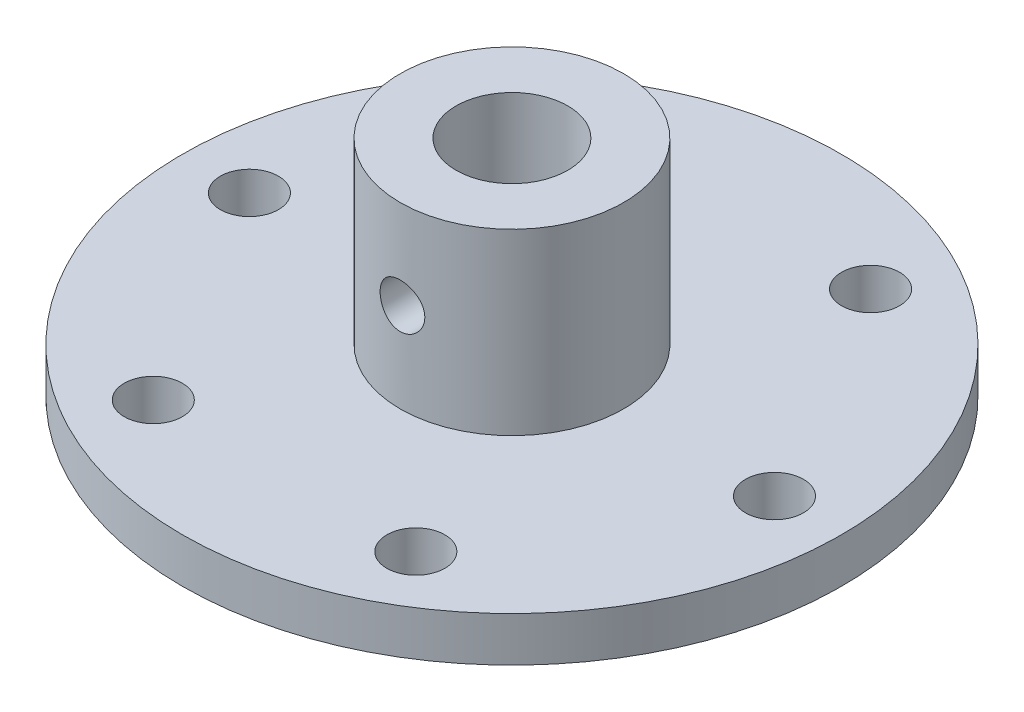
ISO-10303-21;
HEADER;
FILE_DESCRIPTION(('STEP AP214'),'2;1');
FILE_NAME('part.step','',(''),(''),'','','');
FILE_SCHEMA(('AUTOMOTIVE_DESIGN { 1 0 10303 214 1 1 1 1 }'));
ENDSEC;
DATA;
#1=APPLICATION_CONTEXT('core data for automotive mechanical design processes');
#2=APPLICATION_PROTOCOL_DEFINITION('international standard','automotive_design',2000,#1);
#3=PRODUCT_CONTEXT('',#1,'mechanical');
#4=PRODUCT('Part','Part','',(#3));
#5=PRODUCT_RELATED_PRODUCT_CATEGORY('part','',(#4));
#6=PRODUCT_DEFINITION_FORMATION('','',#4);
#7=PRODUCT_DEFINITION_CONTEXT('part definition',#1,'design');
#8=PRODUCT_DEFINITION('design','',#6,#7);
#9=PRODUCT_DEFINITION_SHAPE('','',#8);
#10=(LENGTH_UNIT() NAMED_UNIT(*) SI_UNIT(.MILLI.,.METRE.));
#11=(NAMED_UNIT(*) PLANE_ANGLE_UNIT() SI_UNIT($,.RADIAN.));
#12=(NAMED_UNIT(*) SI_UNIT($,.STERADIAN.) SOLID_ANGLE_UNIT());
#13=UNCERTAINTY_MEASURE_WITH_UNIT(LENGTH_MEASURE(1.E-05),#10,'distance_accuracy_value','');
#14=(GEOMETRIC_REPRESENTATION_CONTEXT(3) GLOBAL_UNCERTAINTY_ASSIGNED_CONTEXT((#13)) GLOBAL_UNIT_ASSIGNED_CONTEXT((#10,
#11,#12)) REPRESENTATION_CONTEXT('',''));
#15=CARTESIAN_POINT('',(0.,0.,0.));
#16=DIRECTION('',(0.,0.,1.));
#17=DIRECTION('',(1.,0.,0.));
#18=AXIS2_PLACEMENT_3D('',#15,#16,#17);
#19=CARTESIAN_POINT('',(0.,4.,0.));
#20=DIRECTION('',(0.,-1.,0.));
#21=DIRECTION('',(0.,0.,-1.));
#22=AXIS2_PLACEMENT_3D('',#19,#20,#21);
#23=CYLINDRICAL_SURFACE('',#22,29.5);
#24=CARTESIAN_POINT('',(0.,4.,0.));
#25=DIRECTION('',(0.,1.,0.));
#26=DIRECTION('',(0.,0.,1.));
#27=AXIS2_PLACEMENT_3D('',#24,#25,#26);
#28=CIRCLE('',#27,29.5);
#29=CARTESIAN_POINT('',(0.,4.,29.5));
#30=VERTEX_POINT('',#29);
#31=EDGE_CURVE('E10',#30,#30,#28,.T.);
#32=ORIENTED_EDGE('',*,*,#31,.F.);
#33=EDGE_LOOP('',(#32));
#34=FACE_BOUND('',#33,.T.);
#35=CARTESIAN_POINT('',(0.,0.,0.));
#36=DIRECTION('',(0.,1.,0.));
#37=DIRECTION('',(0.,0.,1.));
#38=AXIS2_PLACEMENT_3D('',#35,#36,#37);
#39=CIRCLE('',#38,29.5);
#40=CARTESIAN_POINT('',(0.,0.,29.5));
#41=VERTEX_POINT('',#40);
#42=EDGE_CURVE('E75',#41,#41,#39,.T.);
#43=ORIENTED_EDGE('',*,*,#42,.T.);
#44=EDGE_LOOP('',(#43));
#45=FACE_BOUND('',#44,.T.);
#46=ADVANCED_FACE('F34',(#34,#45),#23,.T.);
#47=CARTESIAN_POINT('',(23.5,4.,0.));
#48=DIRECTION('',(0.,-1.,0.));
#49=DIRECTION('',(0.,0.,-1.));
#50=AXIS2_PLACEMENT_3D('',#47,#48,#49);
#51=CYLINDRICAL_SURFACE('',#50,2.6);
#52=CARTESIAN_POINT('',(23.5,4.,0.));
#53=DIRECTION('',(0.,1.,0.));
#54=DIRECTION('',(0.,0.,1.));
#55=AXIS2_PLACEMENT_3D('',#52,#53,#54);
#56=CIRCLE('',#55,2.6);
#57=CARTESIAN_POINT('',(23.5,4.,2.6));
#58=VERTEX_POINT('',#57);
#59=EDGE_CURVE('E47',#58,#58,#56,.T.);
#60=ORIENTED_EDGE('',*,*,#59,.T.);
#61=EDGE_LOOP('',(#60));
#62=FACE_BOUND('',#61,.T.);
#63=CARTESIAN_POINT('',(23.5,0.,0.));
#64=DIRECTION('',(0.,1.,0.));
#65=DIRECTION('',(0.,0.,1.));
#66=AXIS2_PLACEMENT_3D('',#63,#64,#65);
#67=CIRCLE('',#66,2.6);
#68=CARTESIAN_POINT('',(23.5,0.,2.6));
#69=VERTEX_POINT('',#68);
#70=EDGE_CURVE('E72',#69,#69,#67,.T.);
#71=ORIENTED_EDGE('',*,*,#70,.F.);
#72=EDGE_LOOP('',(#71));
#73=FACE_BOUND('',#72,.T.);
#74=ADVANCED_FACE('F123',(#62,#73),#51,.F.);
#75=CARTESIAN_POINT('',(11.75,4.,20.3515969889343));
#76=DIRECTION('',(0.,-1.,0.));
#77=DIRECTION('',(0.,0.,-1.));
#78=AXIS2_PLACEMENT_3D('',#75,#76,#77);
#79=CYLINDRICAL_SURFACE('',#78,2.6);
#80=CARTESIAN_POINT('',(11.75,4.,20.3515969889343));
#81=DIRECTION('',(0.,1.,0.));
#82=DIRECTION('',(0.,0.,1.));
#83=AXIS2_PLACEMENT_3D('',#80,#81,#82);
#84=CIRCLE('',#83,2.6);
#85=CARTESIAN_POINT('',(11.75,4.,22.9515969889343));
#86=VERTEX_POINT('',#85);
#87=EDGE_CURVE('E52',#86,#86,#84,.T.);
#88=ORIENTED_EDGE('',*,*,#87,.T.);
#89=EDGE_LOOP('',(#88));
#90=FACE_BOUND('',#89,.T.);
#91=CARTESIAN_POINT('',(11.75,0.,20.3515969889343));
#92=DIRECTION('',(0.,1.,0.));
#93=DIRECTION('',(0.,0.,1.));
#94=AXIS2_PLACEMENT_3D('',#91,#92,#93);
#95=CIRCLE('',#94,2.6);
#96=CARTESIAN_POINT('',(11.75,0.,22.9515969889343));
#97=VERTEX_POINT('',#96);
#98=EDGE_CURVE('E69',#97,#97,#95,.T.);
#99=ORIENTED_EDGE('',*,*,#98,.F.);
#100=EDGE_LOOP('',(#99));
#101=FACE_BOUND('',#100,.T.);
#102=ADVANCED_FACE('F127',(#90,#101),#79,.F.);
#103=CARTESIAN_POINT('',(-11.7500000000001,4.,20.3515969889343));
#104=DIRECTION('',(0.,-1.,0.));
#105=DIRECTION('',(0.,0.,-1.));
#106=AXIS2_PLACEMENT_3D('',#103,#104,#105);
#107=CYLINDRICAL_SURFACE('',#106,2.6);
#108=CARTESIAN_POINT('',(-11.7500000000001,4.,20.3515969889343));
#109=DIRECTION('',(0.,1.,0.));
#110=DIRECTION('',(0.,0.,1.));
#111=AXIS2_PLACEMENT_3D('',#108,#109,#110);
#112=CIRCLE('',#111,2.6);
#113=CARTESIAN_POINT('',(-11.7500000000001,4.,22.9515969889343));
#114=VERTEX_POINT('',#113);
#115=EDGE_CURVE('E185',#114,#114,#112,.T.);
#116=ORIENTED_EDGE('',*,*,#115,.T.);
#117=EDGE_LOOP('',(#116));
#118=FACE_BOUND('',#117,.T.);
#119=CARTESIAN_POINT('',(-11.7500000000001,0.,20.3515969889343));
#120=DIRECTION('',(0.,1.,0.));
#121=DIRECTION('',(0.,0.,1.));
#122=AXIS2_PLACEMENT_3D('',#119,#120,#121);
#123=CIRCLE('',#122,2.6);
#124=CARTESIAN_POINT('',(-11.7500000000001,0.,22.9515969889343));
#125=VERTEX_POINT('',#124);
#126=EDGE_CURVE('E66',#125,#125,#123,.T.);
#127=ORIENTED_EDGE('',*,*,#126,.F.);
#128=EDGE_LOOP('',(#127));
#129=FACE_BOUND('',#128,.T.);
#130=ADVANCED_FACE('F131',(#118,#129),#107,.F.);
#131=CARTESIAN_POINT('',(-23.5,4.,-1.64099622925627E-13));
#132=DIRECTION('',(0.,-1.,0.));
#133=DIRECTION('',(0.,0.,-1.));
#134=AXIS2_PLACEMENT_3D('',#131,#132,#133);
#135=CYLINDRICAL_SURFACE('',#134,2.6);
#136=CARTESIAN_POINT('',(-23.5,4.,-1.64099622925627E-13));
#137=DIRECTION('',(0.,1.,0.));
#138=DIRECTION('',(0.,0.,1.));
#139=AXIS2_PLACEMENT_3D('',#136,#137,#138);
#140=CIRCLE('',#139,2.6);
#141=CARTESIAN_POINT('',(-23.5,4.,2.59999999999984));
#142=VERTEX_POINT('',#141);
#143=EDGE_CURVE('E182',#142,#142,#140,.T.);
#144=ORIENTED_EDGE('',*,*,#143,.T.);
#145=EDGE_LOOP('',(#144));
#146=FACE_BOUND('',#145,.T.);
#147=CARTESIAN_POINT('',(-23.5,0.,-1.64099622925627E-13));
#148=DIRECTION('',(0.,1.,0.));
#149=DIRECTION('',(0.,0.,1.));
#150=AXIS2_PLACEMENT_3D('',#147,#148,#149);
#151=CIRCLE('',#150,2.6);
#152=CARTESIAN_POINT('',(-23.5,0.,2.59999999999984));
#153=VERTEX_POINT('',#152);
#154=EDGE_CURVE('E63',#153,#153,#151,.T.);
#155=ORIENTED_EDGE('',*,*,#154,.F.);
#156=EDGE_LOOP('',(#155));
#157=FACE_BOUND('',#156,.T.);
#158=ADVANCED_FACE('F135',(#146,#157),#135,.F.);
#159=CARTESIAN_POINT('',(-11.7499999999998,4.,-20.3515969889344));
#160=DIRECTION('',(0.,-1.,0.));
#161=DIRECTION('',(0.,0.,-1.));
#162=AXIS2_PLACEMENT_3D('',#159,#160,#161);
#163=CYLINDRICAL_SURFACE('',#162,2.6);
#164=CARTESIAN_POINT('',(-11.7499999999998,4.,-20.3515969889344));
#165=DIRECTION('',(0.,1.,0.));
#166=DIRECTION('',(0.,0.,1.));
#167=AXIS2_PLACEMENT_3D('',#164,#165,#166);
#168=CIRCLE('',#167,2.6);
#169=CARTESIAN_POINT('',(-11.7499999999998,4.,-17.7515969889344));
#170=VERTEX_POINT('',#169);
#171=EDGE_CURVE('E149',#170,#170,#168,.T.);
#172=ORIENTED_EDGE('',*,*,#171,.T.);
#173=EDGE_LOOP('',(#172));
#174=FACE_BOUND('',#173,.T.);
#175=CARTESIAN_POINT('',(-11.7499999999998,0.,-20.3515969889344));
#176=DIRECTION('',(0.,1.,0.));
#177=DIRECTION('',(0.,0.,1.));
#178=AXIS2_PLACEMENT_3D('',#175,#176,#177);
#179=CIRCLE('',#178,2.6);
#180=CARTESIAN_POINT('',(-11.7499999999998,0.,-17.7515969889344));
#181=VERTEX_POINT('',#180);
#182=EDGE_CURVE('E59',#181,#181,#179,.T.);
#183=ORIENTED_EDGE('',*,*,#182,.F.);
#184=EDGE_LOOP('',(#183));
#185=FACE_BOUND('',#184,.T.);
#186=ADVANCED_FACE('F138',(#174,#185),#163,.F.);
#187=CARTESIAN_POINT('',(11.7500000000002,4.,-20.3515969889342));
#188=DIRECTION('',(0.,-1.,0.));
#189=DIRECTION('',(0.,0.,-1.));
#190=AXIS2_PLACEMENT_3D('',#187,#188,#189);
#191=CYLINDRICAL_SURFACE('',#190,2.60000000000001);
#192=CARTESIAN_POINT('',(11.7500000000002,4.,-20.3515969889342));
#193=DIRECTION('',(0.,1.,0.));
#194=DIRECTION('',(0.,0.,1.));
#195=AXIS2_PLACEMENT_3D('',#192,#193,#194);
#196=CIRCLE('',#195,2.60000000000001);
#197=CARTESIAN_POINT('',(11.7500000000002,4.,-17.7515969889342));
#198=VERTEX_POINT('',#197);
#199=EDGE_CURVE('E80',#198,#198,#196,.T.);
#200=ORIENTED_EDGE('',*,*,#199,.T.);
#201=EDGE_LOOP('',(#200));
#202=FACE_BOUND('',#201,.T.);
#203=CARTESIAN_POINT('',(11.7500000000002,0.,-20.3515969889342));
#204=DIRECTION('',(0.,1.,0.));
#205=DIRECTION('',(0.,0.,1.));
#206=AXIS2_PLACEMENT_3D('',#203,#204,#205);
#207=CIRCLE('',#206,2.60000000000001);
#208=CARTESIAN_POINT('',(11.7500000000002,0.,-17.7515969889342));
#209=VERTEX_POINT('',#208);
#210=EDGE_CURVE('E56',#209,#209,#207,.T.);
#211=ORIENTED_EDGE('',*,*,#210,.F.);
#212=EDGE_LOOP('',(#211));
#213=FACE_BOUND('',#212,.T.);
#214=ADVANCED_FACE('F36',(#202,#213),#191,.F.);
#215=CARTESIAN_POINT('',(0.,4.,0.));
#216=DIRECTION('',(0.,-1.,0.));
#217=DIRECTION('',(0.,0.,-1.));
#218=AXIS2_PLACEMENT_3D('',#215,#216,#217);
#219=CYLINDRICAL_SURFACE('',#218,5.);
#220=CARTESIAN_POINT('',(0.,14.,-5.));
#221=CARTESIAN_POINT('',(-0.107493005442891,13.9999901481763,-4.99999271227085));
#222=CARTESIAN_POINT('',(-0.215172564090673,13.9912822479116,-4.99649294306932));
#223=CARTESIAN_POINT('',(-0.427496480417895,13.9567522964788,-4.98283453100641));
#224=CARTESIAN_POINT('',(-0.532131777561248,13.9308837209139,-4.97265778698877));
#225=CARTESIAN_POINT('',(-0.734953922727403,13.8631239219412,-4.94674209213118));
#226=CARTESIAN_POINT('',(-0.833160661616958,13.8212851537833,-4.93102136364072));
#227=CARTESIAN_POINT('',(-1.02107197032837,13.7229808266735,-4.89556610796078));
#228=CARTESIAN_POINT('',(-1.11077947675099,13.6665203450811,-4.87583297458057));
#229=CARTESIAN_POINT('',(-1.28350100757039,13.5377645014391,-4.83330886170419));
#230=CARTESIAN_POINT('',(-1.36606227255021,13.4648933437597,-4.81042296929191));
#231=CARTESIAN_POINT('',(-1.51817500478472,13.3065999965232,-4.76460576906195));
#232=CARTESIAN_POINT('',(-1.58772010713353,13.2211717027883,-4.74167444453792));
#233=CARTESIAN_POINT('',(-1.71487456729288,13.0355719297577,-4.69722791797136));
#234=CARTESIAN_POINT('',(-1.77181498119547,12.9349135139768,-4.67582115964951));
#235=CARTESIAN_POINT('',(-1.86775471903715,12.72446360158,-4.63833647186793));
#236=CARTESIAN_POINT('',(-1.90676256428583,12.6146764721516,-4.62225601244176));
#237=CARTESIAN_POINT('',(-1.96389882339587,12.3942876664079,-4.59826357660819));
#238=CARTESIAN_POINT('',(-1.98289396580565,12.2839487644238,-4.59001420355605));
#239=CARTESIAN_POINT('',(-2.00217296164003,12.0613650016927,-4.58164004049144));
#240=CARTESIAN_POINT('',(-2.00246601631322,11.949121105375,-4.58151125522768));
#241=CARTESIAN_POINT('',(-1.98498936750454,11.734243328542,-4.58910500279994));
#242=CARTESIAN_POINT('',(-1.96847531430514,11.631484285591,-4.5962817503845));
#243=CARTESIAN_POINT('',(-1.91994688029782,11.4303404439933,-4.61676187607836));
#244=CARTESIAN_POINT('',(-1.88792979480463,11.3319564118897,-4.63006632321673));
#245=CARTESIAN_POINT('',(-1.80869473255107,11.139982163804,-4.6615948508853));
#246=CARTESIAN_POINT('',(-1.76117986231531,11.0465307609453,-4.67991379280788));
#247=CARTESIAN_POINT('',(-1.65250646073221,10.8685841836384,-4.7193811638989));
#248=CARTESIAN_POINT('',(-1.59134280510084,10.7840923905972,-4.74053065456849));
#249=CARTESIAN_POINT('',(-1.45155059945443,10.619590271198,-4.78526736742271));
#250=CARTESIAN_POINT('',(-1.37193746297063,10.540431270554,-4.80891664976152));
#251=CARTESIAN_POINT('',(-1.20031442743019,10.396315521998,-4.85459824958282));
#252=CARTESIAN_POINT('',(-1.10830206533443,10.3313616025897,-4.87663024445325));
#253=CARTESIAN_POINT('',(-0.912077652605839,10.2163825525842,-4.91714681264548));
#254=CARTESIAN_POINT('',(-0.807660491346474,10.1666777188029,-4.93555270095415));
#255=CARTESIAN_POINT('',(-0.591023765482879,10.0858321389219,-4.96614828328759));
#256=CARTESIAN_POINT('',(-0.478808196849672,10.0546819624426,-4.97834113462382));
#257=CARTESIAN_POINT('',(-0.256895887607818,10.0135517045803,-4.99456139506911));
#258=CARTESIAN_POINT('',(-0.147443293985533,10.0024275457464,-4.99902945833514));
#259=CARTESIAN_POINT('',(0.0718453098078188,9.99828689947139,-5.00068478510631));
#260=CARTESIAN_POINT('',(0.181681213223925,10.0052657184525,-4.99787393582291));
#261=CARTESIAN_POINT('',(0.393432739121989,10.036291752552,-4.98557567063753));
#262=CARTESIAN_POINT('',(0.495482491775476,10.059557980351,-4.97639391345523));
#263=CARTESIAN_POINT('',(0.694135428060782,10.1214357083098,-4.952594414055));
#264=CARTESIAN_POINT('',(0.790737910224846,10.1600491796687,-4.9379759735653));
#265=CARTESIAN_POINT('',(0.979078785816703,10.25278493968,-4.90416594770812));
#266=CARTESIAN_POINT('',(1.07057802275541,10.3073454720432,-4.88484815979803));
#267=CARTESIAN_POINT('',(1.24344359124656,10.4299403239056,-4.84373364745525));
#268=CARTESIAN_POINT('',(1.32480584076113,10.4979800429226,-4.8219359311027));
#269=CARTESIAN_POINT('',(1.48072304302882,10.6508700129496,-4.77645117638112));
#270=CARTESIAN_POINT('',(1.55447393380607,10.7365335415062,-4.75273441425052));
#271=CARTESIAN_POINT('',(1.68675119741371,10.9194400830094,-4.70741672917132));
#272=CARTESIAN_POINT('',(1.74527506133751,11.01668500034,-4.68581615526511));
#273=CARTESIAN_POINT('',(1.84580750193163,11.2214616945941,-4.64714299907708));
#274=CARTESIAN_POINT('',(1.88765059453445,11.3290839992123,-4.63011630884788));
#275=CARTESIAN_POINT('',(1.95229621970531,11.5507336517152,-4.60323673477931));
#276=CARTESIAN_POINT('',(1.97511280526932,11.6647562058124,-4.59337855695998));
#277=CARTESIAN_POINT('',(1.9997156172784,11.8871279017745,-4.58271759299926));
#278=CARTESIAN_POINT('',(2.00289708230287,11.9952948395934,-4.58131421008171));
#279=CARTESIAN_POINT('',(1.99180315927753,12.2105448577133,-4.58614836033098));
#280=CARTESIAN_POINT('',(1.97752998791378,12.3176280739026,-4.59238492324793));
#281=CARTESIAN_POINT('',(1.93307136615365,12.523332189855,-4.61126649079021));
#282=CARTESIAN_POINT('',(1.90353749357098,12.622120274433,-4.62364831827449));
#283=CARTESIAN_POINT('',(1.83000544849101,12.8133786296135,-4.65324001232696));
#284=CARTESIAN_POINT('',(1.78600328139381,12.9058471468998,-4.67045121206007));
#285=CARTESIAN_POINT('',(1.68187276275973,13.0876096192708,-4.70898609604491));
#286=CARTESIAN_POINT('',(1.62096533515949,13.1764186701305,-4.73048882313242));
#287=CARTESIAN_POINT('',(1.4858921192715,13.3429933172038,-4.77463804372237));
#288=CARTESIAN_POINT('',(1.41172233481812,13.4207555721283,-4.79728488048406));
#289=CARTESIAN_POINT('',(1.24650550627246,13.5682028532636,-4.84293567087394));
#290=CARTESIAN_POINT('',(1.15467600114614,13.6370373068981,-4.86586757962185));
#291=CARTESIAN_POINT('',(0.959900320285777,13.7583370426216,-4.90800406713717));
#292=CARTESIAN_POINT('',(0.856949004547236,13.8107947121525,-4.92720691092906));
#293=CARTESIAN_POINT('',(0.644738062495202,13.8966222151903,-4.95939714815861));
#294=CARTESIAN_POINT('',(0.535631618219694,13.9303293235603,-4.97249363055028));
#295=CARTESIAN_POINT('',(0.31287654628122,13.9786391209543,-4.99144306209366));
#296=CARTESIAN_POINT('',(0.199243525858912,13.9933024367439,-4.99731899495638));
#297=CARTESIAN_POINT('',(0.0569122978909292,13.9993953809783,-4.99975899504136));
#298=CARTESIAN_POINT('',(0.0284626887407582,14.0000026086292,-5.00000192969176));
#299=CARTESIAN_POINT('',(0.,14.,-5.));
#300=B_SPLINE_CURVE_WITH_KNOTS('',3,(#220,#221,#222,#223,#224,#225,#226,#227,#228,#229,#230,
#231,#232,#233,#234,#235,#236,#237,#238,#239,#240,#241,#242,#243,#244,#245,#246,#247,#248,#249,
#250,#251,#252,#253,#254,#255,#256,#257,#258,#259,#260,#261,#262,#263,#264,#265,#266,#267,#268,
#269,#270,#271,#272,#273,#274,#275,#276,#277,#278,#279,#280,#281,#282,#283,#284,#285,#286,#287,
#288,#289,#290,#291,#292,#293,#294,#295,#296,#297,#298,#299),.UNSPECIFIED.,.T.,.F.,(4,2,2,2,2,2,
2,2,2,2,2,2,2,2,2,2,2,2,2,2,2,2,2,2,2,2,2,2,2,2,2,2,2,2,2,2,2,2,2,4),(0.,0.32240298789307,
0.645683636007934,0.967911457471581,1.29002753567984,1.62597381700397,1.96208394934411,
2.31315258819217,2.66405423118268,2.99904105308828,3.33386306340488,3.64538328401372,
3.95695787256047,4.27489126298816,4.59294421938183,4.93558349186557,5.27829092839733,
5.62776913162806,5.9770695611379,6.30569184528007,6.63422893570082,6.94800455564365,
7.26182048993796,7.58523513398262,7.90877959498968,8.25368474624413,8.59864669043748,
8.94695045140827,9.29499672645933,9.61799673392748,9.94095572563045,10.2511431854877,
10.5614163580516,10.8894546805669,11.2175920134839,11.5670042353384,11.9165786364053,
12.2596430101332,12.6016125240434,12.686980458968),.UNSPECIFIED.);
#301=CARTESIAN_POINT('',(0.,14.,-5.));
#302=VERTEX_POINT('',#301);
#303=EDGE_CURVE('E107',#302,#302,#300,.T.);
#304=ORIENTED_EDGE('',*,*,#303,.F.);
#305=EDGE_LOOP('',(#304));
#306=FACE_BOUND('',#305,.T.);
#307=CARTESIAN_POINT('',(2.,12.,4.58257569495584));
#308=CARTESIAN_POINT('',(1.99999540068022,11.892876310287,4.58258022779737));
#309=CARTESIAN_POINT('',(1.99134173553407,11.7855737056682,4.58638433797122));
#310=CARTESIAN_POINT('',(1.95706710874823,11.5740609159004,4.601110833066));
#311=CARTESIAN_POINT('',(1.93140279032341,11.4698593456615,4.61205140628347));
#312=CARTESIAN_POINT('',(1.86423554476216,11.2679481910292,4.63960410719222));
#313=CARTESIAN_POINT('',(1.82279228998551,11.1702157567088,4.65619484260882));
#314=CARTESIAN_POINT('',(1.72542013194152,10.9831146451377,4.69314677188873));
#315=CARTESIAN_POINT('',(1.66949439157707,10.8937441474759,4.71350714220611));
#316=CARTESIAN_POINT('',(1.54132201423254,10.7207396854557,4.75700861562335));
#317=CARTESIAN_POINT('',(1.46837936836551,10.6376436006028,4.78023917022606));
#318=CARTESIAN_POINT('',(1.30970909513216,10.4844709791442,4.82612457915277));
#319=CARTESIAN_POINT('',(1.22397701877348,10.4143989922903,4.84877922991761));
#320=CARTESIAN_POINT('',(1.03800631337304,10.2865936096903,4.89203407641395));
#321=CARTESIAN_POINT('',(0.937328966419099,10.2294557003141,4.9125180361257));
#322=CARTESIAN_POINT('',(0.726825322068644,10.1331564298262,4.94803927702516));
#323=CARTESIAN_POINT('',(0.617002769076889,10.0939877537511,4.96307877403249));
#324=CARTESIAN_POINT('',(0.39696642703976,10.0366585140069,4.98538324990609));
#325=CARTESIAN_POINT('',(0.287028984858322,10.0175726860298,4.99298936770628));
#326=CARTESIAN_POINT('',(0.0652663285839673,9.99797151421855,5.00080310687431));
#327=CARTESIAN_POINT('',(-0.0465581658394059,9.99744924403421,5.00101348770556));
#328=CARTESIAN_POINT('',(-0.262232494702084,10.0144827698042,4.99421962820612));
#329=CARTESIAN_POINT('',(-0.366177452870453,10.0310247727547,4.98761996771485));
#330=CARTESIAN_POINT('',(-0.56967310922191,10.079992876303,4.96849291469141));
#331=CARTESIAN_POINT('',(-0.669223484391236,10.1124201423985,4.95596508721342));
#332=CARTESIAN_POINT('',(-0.862897938510555,10.1926364828783,4.92596824457467));
#333=CARTESIAN_POINT('',(-0.956917623378893,10.2406497148154,4.90842760466223));
#334=CARTESIAN_POINT('',(-1.13580815074131,10.3504650069192,4.87014585180275));
#335=CARTESIAN_POINT('',(-1.22067584271796,10.4122717931002,4.84940364267149));
#336=CARTESIAN_POINT('',(-1.38476882799017,10.5526491359439,4.80521637176122));
#337=CARTESIAN_POINT('',(-1.46325784526632,10.6320538925728,4.78168326511759));
#338=CARTESIAN_POINT('',(-1.60610741539265,10.802990571832,4.73561660973263));
#339=CARTESIAN_POINT('',(-1.67046334378698,10.8945264481956,4.71308339008076));
#340=CARTESIAN_POINT('',(-1.78490418871927,11.0904190223739,4.67096897409023));
#341=CARTESIAN_POINT('',(-1.83453465163626,11.1950648303387,4.65148914057708));
#342=CARTESIAN_POINT('',(-1.91517625986646,11.4122154903122,4.61887590344084));
#343=CARTESIAN_POINT('',(-1.94619949837798,11.5247151847266,4.60573837891311));
#344=CARTESIAN_POINT('',(-1.9869549488549,11.7470357774674,4.58829759702716));
#345=CARTESIAN_POINT('',(-1.99787209681454,11.8566004471286,4.58350366456138));
#346=CARTESIAN_POINT('',(-2.00156132644288,12.0760772077596,4.58189497869038));
#347=CARTESIAN_POINT('',(-1.99433891059128,12.1859891832757,4.58507780560362));
#348=CARTESIAN_POINT('',(-1.96303289479003,12.3964589349569,4.59856044359114));
#349=CARTESIAN_POINT('',(-1.93993306202386,12.4971929374001,4.60844457798302));
#350=CARTESIAN_POINT('',(-1.87880418691087,12.6932884047855,4.6337005102734));
#351=CARTESIAN_POINT('',(-1.84077183430228,12.7886486731072,4.64907352488598));
#352=CARTESIAN_POINT('',(-1.74913563948157,12.9756023577957,4.68433781860101));
#353=CARTESIAN_POINT('',(-1.69496286826465,13.0668861886945,4.70438704639177));
#354=CARTESIAN_POINT('',(-1.57316522444182,13.2394829874416,4.74650385157795));
#355=CARTESIAN_POINT('',(-1.5055348734819,13.3207918727954,4.76857224896045));
#356=CARTESIAN_POINT('',(-1.35284421168058,13.4773734085994,4.81420915971416));
#357=CARTESIAN_POINT('',(-1.26686542944544,13.5517565652916,4.83776807285233));
#358=CARTESIAN_POINT('',(-1.08308363336851,13.6851770766098,4.88219794567532));
#359=CARTESIAN_POINT('',(-0.985280138466613,13.7442138065951,4.90306879593135));
#360=CARTESIAN_POINT('',(-0.780279934003019,13.8450476264633,4.9398371590039));
#361=CARTESIAN_POINT('',(-0.673085480998748,13.8868488441737,4.9557358624066));
#362=CARTESIAN_POINT('',(-0.452393590914551,13.9515488523998,4.98072713468904));
#363=CARTESIAN_POINT('',(-0.338899610276823,13.9744579014107,4.98982339706103));
#364=CARTESIAN_POINT('',(-0.116816510362619,13.9995047016528,4.99979008211858));
#365=CARTESIAN_POINT('',(-0.00839049265209014,14.002900128562,5.00115846749745));
#366=CARTESIAN_POINT('',(0.207433835792263,13.9921445206165,4.99686042373721));
#367=CARTESIAN_POINT('',(0.314832299614384,13.9779961418444,4.99119505948774));
#368=CARTESIAN_POINT('',(0.522170901733395,13.9334532120001,4.97371513381836));
#369=CARTESIAN_POINT('',(0.622238803864867,13.9035710552435,4.96209480698998));
#370=CARTESIAN_POINT('',(0.815922355542602,13.8289471941189,4.93394947767358));
#371=CARTESIAN_POINT('',(0.909536811189121,13.7842027490609,4.91742357062859));
#372=CARTESIAN_POINT('',(1.09220303880515,13.6788968066468,4.88018094611867));
#373=CARTESIAN_POINT('',(1.18087037518738,13.6177237246749,4.859311306872));
#374=CARTESIAN_POINT('',(1.34705404014793,13.482211461253,4.8158940222708));
#375=CARTESIAN_POINT('',(1.42456572919735,13.4078668303918,4.79334568464253));
#376=CARTESIAN_POINT('',(1.57120121894449,13.2426848531513,4.7473776736768));
#377=CARTESIAN_POINT('',(1.63950871002775,13.1511114248559,4.72399047228096));
#378=CARTESIAN_POINT('',(1.75984762763149,12.9570575642792,4.68049656850749));
#379=CARTESIAN_POINT('',(1.81187714055767,12.8545758515465,4.66039025195448));
#380=CARTESIAN_POINT('',(1.89399048451634,12.6509638135298,4.62758914239063));
#381=CARTESIAN_POINT('',(1.92562535665267,12.5505383972876,4.61439096680415));
#382=CARTESIAN_POINT('',(1.97271990928489,12.3455109585074,4.5944582603412));
#383=CARTESIAN_POINT('',(1.98822466191608,12.2409214265756,4.58770572290435));
#384=CARTESIAN_POINT('',(1.99692202185513,12.1132217608885,4.5839176394209));
#385=CARTESIAN_POINT('',(1.99807530751895,12.0905985196436,4.58341531117284));
#386=CARTESIAN_POINT('',(1.9996148112425,12.0453195232028,4.58274384722723));
#387=CARTESIAN_POINT('',(2.0000009730612,12.0226637657448,4.5825747359592));
#388=CARTESIAN_POINT('',(2.,12.,4.58257569495584));
#389=B_SPLINE_CURVE_WITH_KNOTS('',3,(#307,#308,#309,#310,#311,#312,#313,#314,#315,#316,#317,
#318,#319,#320,#321,#322,#323,#324,#325,#326,#327,#328,#329,#330,#331,#332,#333,#334,#335,#336,
#337,#338,#339,#340,#341,#342,#343,#344,#345,#346,#347,#348,#349,#350,#351,#352,#353,#354,#355,
#356,#357,#358,#359,#360,#361,#362,#363,#364,#365,#366,#367,#368,#369,#370,#371,#372,#373,#374,
#375,#376,#377,#378,#379,#380,#381,#382,#383,#384,#385,#386,#387,#388),.UNSPECIFIED.,.T.,.F.,(4,
2,2,2,2,2,2,2,2,2,2,2,2,2,2,2,2,2,2,2,2,2,2,2,2,2,2,2,2,2,2,2,2,2,2,2,2,2,2,2,4),(0.,
0.321277648767652,0.643377335822243,0.964270823293388,1.28509428823861,1.62255618284424,
1.96013574348342,2.31102669091428,2.6617746696948,2.99554182887183,3.32918445305672,
3.64408644830302,3.95901155129059,4.27868300234898,4.59846414940031,4.93924044081356,
5.28012807127127,5.63064458717257,5.98093304800101,6.3098214752442,6.63861014907939,
6.94867248085145,7.25880358651637,7.581511546527,7.90435114525848,8.25103734246979,
8.59773764852747,8.94435487312811,9.29078375954135,9.61461039755952,9.93838801512601,
10.2522199444335,10.5661097782858,10.8938705113992,11.2217671656421,11.5699625328561,
11.9181988175919,12.2351666081908,12.5512463021924,12.619212852096,12.6871843847255),.UNSPECIFIED.);
#390=CARTESIAN_POINT('',(2.,12.,4.58257569495584));
#391=VERTEX_POINT('',#390);
#392=EDGE_CURVE('E101',#391,#391,#389,.T.);
#393=ORIENTED_EDGE('',*,*,#392,.F.);
#394=EDGE_LOOP('',(#393));
#395=FACE_BOUND('',#394,.T.);
#396=CARTESIAN_POINT('',(0.,0.,0.));
#397=DIRECTION('',(0.,1.,0.));
#398=DIRECTION('',(0.,0.,1.));
#399=AXIS2_PLACEMENT_3D('',#396,#397,#398);
#400=CIRCLE('',#399,5.);
#401=CARTESIAN_POINT('',(0.,0.,5.));
#402=VERTEX_POINT('',#401);
#403=EDGE_CURVE('E78',#402,#402,#400,.T.);
#404=ORIENTED_EDGE('',*,*,#403,.F.);
#405=EDGE_LOOP('',(#404));
#406=FACE_BOUND('',#405,.T.);
#407=CARTESIAN_POINT('',(0.,20.,0.));
#408=DIRECTION('',(0.,1.,0.));
#409=DIRECTION('',(0.,0.,1.));
#410=AXIS2_PLACEMENT_3D('',#407,#408,#409);
#411=CIRCLE('',#410,5.);
#412=CARTESIAN_POINT('',(0.,20.,5.));
#413=VERTEX_POINT('',#412);
#414=EDGE_CURVE('E170',#413,#413,#411,.T.);
#415=ORIENTED_EDGE('',*,*,#414,.T.);
#416=EDGE_LOOP('',(#415));
#417=FACE_BOUND('',#416,.T.);
#418=ADVANCED_FACE('F112',(#306,#395,#406,#417),#219,.F.);
#419=CARTESIAN_POINT('',(0.,4.,0.));
#420=DIRECTION('',(0.,1.,0.));
#421=DIRECTION('',(0.,0.,1.));
#422=AXIS2_PLACEMENT_3D('',#419,#420,#421);
#423=PLANE('',#422);
#424=CARTESIAN_POINT('',(0.,4.,0.));
#425=DIRECTION('',(0.,1.,0.));
#426=DIRECTION('',(0.,0.,1.));
#427=AXIS2_PLACEMENT_3D('',#424,#425,#426);
#428=CIRCLE('',#427,10.);
#429=CARTESIAN_POINT('',(0.,4.,10.));
#430=VERTEX_POINT('',#429);
#431=EDGE_CURVE('E60',#430,#430,#428,.F.);
#432=ORIENTED_EDGE('',*,*,#431,.T.);
#433=EDGE_LOOP('',(#432));
#434=FACE_BOUND('',#433,.T.);
#435=ORIENTED_EDGE('',*,*,#199,.F.);
#436=EDGE_LOOP('',(#435));
#437=FACE_BOUND('',#436,.T.);
#438=ORIENTED_EDGE('',*,*,#171,.F.);
#439=EDGE_LOOP('',(#438));
#440=FACE_BOUND('',#439,.T.);
#441=ORIENTED_EDGE('',*,*,#143,.F.);
#442=EDGE_LOOP('',(#441));
#443=FACE_BOUND('',#442,.T.);
#444=ORIENTED_EDGE('',*,*,#115,.F.);
#445=EDGE_LOOP('',(#444));
#446=FACE_BOUND('',#445,.T.);
#447=ORIENTED_EDGE('',*,*,#87,.F.);
#448=EDGE_LOOP('',(#447));
#449=FACE_BOUND('',#448,.T.);
#450=ORIENTED_EDGE('',*,*,#59,.F.);
#451=EDGE_LOOP('',(#450));
#452=FACE_BOUND('',#451,.T.);
#453=ORIENTED_EDGE('',*,*,#31,.T.);
#454=EDGE_LOOP('',(#453));
#455=FACE_BOUND('',#454,.T.);
#456=ADVANCED_FACE('F117',(#434,#437,#440,#443,#446,#449,#452,#455),#423,.T.);
#457=CARTESIAN_POINT('',(0.,0.,0.));
#458=DIRECTION('',(0.,1.,0.));
#459=DIRECTION('',(0.,0.,1.));
#460=AXIS2_PLACEMENT_3D('',#457,#458,#459);
#461=PLANE('',#460);
#462=ORIENTED_EDGE('',*,*,#210,.T.);
#463=EDGE_LOOP('',(#462));
#464=FACE_BOUND('',#463,.T.);
#465=ORIENTED_EDGE('',*,*,#182,.T.);
#466=EDGE_LOOP('',(#465));
#467=FACE_BOUND('',#466,.T.);
#468=ORIENTED_EDGE('',*,*,#154,.T.);
#469=EDGE_LOOP('',(#468));
#470=FACE_BOUND('',#469,.T.);
#471=ORIENTED_EDGE('',*,*,#126,.T.);
#472=EDGE_LOOP('',(#471));
#473=FACE_BOUND('',#472,.T.);
#474=ORIENTED_EDGE('',*,*,#98,.T.);
#475=EDGE_LOOP('',(#474));
#476=FACE_BOUND('',#475,.T.);
#477=ORIENTED_EDGE('',*,*,#70,.T.);
#478=EDGE_LOOP('',(#477));
#479=FACE_BOUND('',#478,.T.);
#480=ORIENTED_EDGE('',*,*,#42,.F.);
#481=EDGE_LOOP('',(#480));
#482=FACE_BOUND('',#481,.T.);
#483=ORIENTED_EDGE('',*,*,#403,.T.);
#484=EDGE_LOOP('',(#483));
#485=FACE_BOUND('',#484,.T.);
#486=ADVANCED_FACE('F119',(#464,#467,#470,#473,#476,#479,#482,#485),#461,.F.);
#487=CARTESIAN_POINT('',(0.,20.,0.));
#488=DIRECTION('',(0.,-1.,0.));
#489=DIRECTION('',(0.,0.,-1.));
#490=AXIS2_PLACEMENT_3D('',#487,#488,#489);
#491=CYLINDRICAL_SURFACE('',#490,10.);
#492=CARTESIAN_POINT('',(0.,14.,-10.));
#493=CARTESIAN_POINT('',(-0.111153813585266,13.9999959110033,-9.99999795161742));
#494=CARTESIAN_POINT('',(-0.222359320403045,13.9907023140647,-9.99812770356462));
#495=CARTESIAN_POINT('',(-0.441627015378038,13.9538029997695,-9.99084731246463));
#496=CARTESIAN_POINT('',(-0.549686635082711,13.926182734397,-9.98543435720372));
#497=CARTESIAN_POINT('',(-0.759460610526625,13.8535174527584,-9.97167298556573));
#498=CARTESIAN_POINT('',(-0.861180935866268,13.8084891263106,-9.96332738153436));
#499=CARTESIAN_POINT('',(-1.05561597772845,13.7023355049774,-9.94460796070629));
#500=CARTESIAN_POINT('',(-1.14833123015162,13.6412111687856,-9.93423426471414));
#501=CARTESIAN_POINT('',(-1.32338695462973,13.5037230114171,-9.9124433065994));
#502=CARTESIAN_POINT('',(-1.40558790231705,13.4271832892176,-9.90101491008695));
#503=CARTESIAN_POINT('',(-1.55607351321605,13.2614151672166,-9.87848360905177));
#504=CARTESIAN_POINT('',(-1.62435708954085,13.1721857773298,-9.86738073000848));
#505=CARTESIAN_POINT('',(-1.74566350669524,12.9825676139763,-9.8466488362523));
#506=CARTESIAN_POINT('',(-1.79854187773173,12.8820847124073,-9.83703414729892));
#507=CARTESIAN_POINT('',(-1.88661133316062,12.6734363619918,-9.82052536116836));
#508=CARTESIAN_POINT('',(-1.92180416487447,12.5652716733073,-9.81363099523923));
#509=CARTESIAN_POINT('',(-1.97305059976965,12.3458312721842,-9.80345610504409));
#510=CARTESIAN_POINT('',(-1.98934899591755,12.2346149117155,-9.80012940214375));
#511=CARTESIAN_POINT('',(-2.00310425545224,12.0109803572713,-9.79732750121254));
#512=CARTESIAN_POINT('',(-2.000563045427,11.8985622873597,-9.79785190935681));
#513=CARTESIAN_POINT('',(-1.97690914620364,11.677506423958,-9.80265102296369));
#514=CARTESIAN_POINT('',(-1.95607708048781,11.5688371887454,-9.80686905717527));
#515=CARTESIAN_POINT('',(-1.8968757692461,11.356567846674,-9.81849092320003));
#516=CARTESIAN_POINT('',(-1.85850568620136,11.252967982162,-9.82589490715558));
#517=CARTESIAN_POINT('',(-1.76504956734944,11.0529694765928,-9.84311237000816));
#518=CARTESIAN_POINT('',(-1.70985230246423,10.9566242408617,-9.85294179627409));
#519=CARTESIAN_POINT('',(-1.58438714914536,10.7744583000544,-9.87389237546124));
#520=CARTESIAN_POINT('',(-1.51411752871365,10.6886388062977,-9.88501367676732));
#521=CARTESIAN_POINT('',(-1.35899986912117,10.5283411950861,-9.90754042482924));
#522=CARTESIAN_POINT('',(-1.27391232242489,10.4540948642817,-9.9189473842181));
#523=CARTESIAN_POINT('',(-1.09237004812402,10.3208923073976,-9.94057697428817));
#524=CARTESIAN_POINT('',(-0.995915174758776,10.2619362774128,-9.95079958977947));
#525=CARTESIAN_POINT('',(-0.794118773757839,10.1609449815481,-9.96893380321774));
#526=CARTESIAN_POINT('',(-0.688763639170598,10.1189362127109,-9.97684177696544));
#527=CARTESIAN_POINT('',(-0.472297952897327,10.0532790519229,-9.98942817975716));
#528=CARTESIAN_POINT('',(-0.361188100144896,10.0296284358527,-9.99410700001063));
#529=CARTESIAN_POINT('',(-0.138358811254298,10.0016870924114,-9.99965343733735));
#530=CARTESIAN_POINT('',(-0.0266806566511496,9.99707916091947,-10.0005834930494));
#531=CARTESIAN_POINT('',(0.195849868385431,10.0064997178844,-9.99870103860205));
#532=CARTESIAN_POINT('',(0.306702284887589,10.0205271587052,-9.99588873882892));
#533=CARTESIAN_POINT('',(0.523411319893084,10.0665567470879,-9.98687664016035));
#534=CARTESIAN_POINT('',(0.629303896679808,10.0983961369958,-9.98070752808413));
#535=CARTESIAN_POINT('',(0.834247254999336,10.1789679653116,-9.96567104122065));
#536=CARTESIAN_POINT('',(0.933297523275081,10.2277016693537,-9.95680346428453));
#537=CARTESIAN_POINT('',(1.12308234737244,10.3413649813026,-9.93719823066589));
#538=CARTESIAN_POINT('',(1.21370025350438,10.4064855620779,-9.92643900874103));
#539=CARTESIAN_POINT('',(1.38283603823842,10.5508183824146,-9.90429469659765));
#540=CARTESIAN_POINT('',(1.46135261786153,10.6300321327997,-9.89290953936776));
#541=CARTESIAN_POINT('',(1.60528118154835,10.8017467037823,-9.8705860711393));
#542=CARTESIAN_POINT('',(1.67047540489731,10.8944314884427,-9.85965720466608));
#543=CARTESIAN_POINT('',(1.78437084010241,11.0896227227134,-9.83968383592388));
#544=CARTESIAN_POINT('',(1.83307271184581,11.1921287791471,-9.83063925826685));
#545=CARTESIAN_POINT('',(1.91230368316392,11.4035364922991,-9.81553481168766));
#546=CARTESIAN_POINT('',(1.9429269995821,11.5124016824206,-9.80945949744373));
#547=CARTESIAN_POINT('',(1.98541730325439,11.7338669069818,-9.8009487358405));
#548=CARTESIAN_POINT('',(1.99728673645023,11.8464664524187,-9.79851281382223));
#549=CARTESIAN_POINT('',(2.00184182173494,12.0700177290886,-9.79758299262758));
#550=CARTESIAN_POINT('',(1.99487157614179,12.180962297854,-9.79901838378602));
#551=CARTESIAN_POINT('',(1.96270460820012,12.4000632998101,-9.80551146969228));
#552=CARTESIAN_POINT('',(1.9375080322586,12.5082197553896,-9.81056913534338));
#553=CARTESIAN_POINT('',(1.86975713699791,12.7184554224811,-9.82370528438317));
#554=CARTESIAN_POINT('',(1.82724501343469,12.8205487210048,-9.83177642037661));
#555=CARTESIAN_POINT('',(1.72610928920321,13.0162074414689,-9.85003429948341));
#556=CARTESIAN_POINT('',(1.66748433754976,13.1097721474503,-9.86022121997788));
#557=CARTESIAN_POINT('',(1.53461182957283,13.2874311443006,-9.88177921046451));
#558=CARTESIAN_POINT('',(1.46011577447036,13.3713375305352,-9.89316745819399));
#559=CARTESIAN_POINT('',(1.29812873802628,13.5255724110583,-9.91572163743909));
#560=CARTESIAN_POINT('',(1.21063477430667,13.5958977806345,-9.92688751726369));
#561=CARTESIAN_POINT('',(1.02403525817649,13.7216692878929,-9.94787664775943));
#562=CARTESIAN_POINT('',(0.924817768859668,13.7769520065601,-9.95768462438492));
#563=CARTESIAN_POINT('',(0.718332721881464,13.8699722451932,-9.9747025017));
#564=CARTESIAN_POINT('',(0.611072521726251,13.907725579065,-9.98191474277232));
#565=CARTESIAN_POINT('',(0.419642977847558,13.9573038960894,-9.99152745190741));
#566=CARTESIAN_POINT('',(0.336563328027569,13.9732863874155,-9.99468606316904));
#567=CARTESIAN_POINT('',(0.168999050420134,13.9946358247167,-9.99892308279786));
#568=CARTESIAN_POINT('',(0.0845144674972379,14.0000031090195,-10.0000015574631));
#569=CARTESIAN_POINT('',(0.,14.,-10.));
#570=B_SPLINE_CURVE_WITH_KNOTS('',3,(#492,#493,#494,#495,#496,#497,#498,#499,#500,#501,#502,
#503,#504,#505,#506,#507,#508,#509,#510,#511,#512,#513,#514,#515,#516,#517,#518,#519,#520,#521,
#522,#523,#524,#525,#526,#527,#528,#529,#530,#531,#532,#533,#534,#535,#536,#537,#538,#539,#540,
#541,#542,#543,#544,#545,#546,#547,#548,#549,#550,#551,#552,#553,#554,#555,#556,#557,#558,#559,
#560,#561,#562,#563,#564,#565,#566,#567,#568,#569),.UNSPECIFIED.,.T.,.F.,(4,2,2,2,2,2,2,2,2,2,2,
2,2,2,2,2,2,2,2,2,2,2,2,2,2,2,2,2,2,2,2,2,2,2,2,2,2,2,4),(0.,0.333152261322517,
0.666569301382645,0.999667470500682,1.33274580446172,1.66986534022437,2.00701119349473,
2.34722390011845,2.68740298730395,3.02312370207175,3.3588100856245,3.68943454012557,
4.02007478507459,4.35294980407185,4.68586309499341,5.02476504982701,5.3636713507964,
5.70310549708048,6.04249851396072,6.3762147135253,6.70991215315735,7.04060907901447,
7.37133078432045,7.70610132066717,8.0409077669186,8.38081257158452,8.72070377446933,
9.05880762065446,9.39686736660829,9.72879445135403,10.0607188698522,10.3918392250622,
10.7229873516373,11.0597615247829,11.3966130906586,11.7369899335127,12.0770591103504,
12.3303755057979,12.5836838274199),.UNSPECIFIED.);
#571=CARTESIAN_POINT('',(0.,14.,-10.));
#572=VERTEX_POINT('',#571);
#573=EDGE_CURVE('E38',#572,#572,#570,.T.);
#574=ORIENTED_EDGE('',*,*,#573,.T.);
#575=EDGE_LOOP('',(#574));
#576=FACE_BOUND('',#575,.T.);
#577=CARTESIAN_POINT('',(2.,12.,9.79795897113271));
#578=CARTESIAN_POINT('',(1.99999589175054,11.8888712490177,9.79796118053292));
#579=CARTESIAN_POINT('',(1.99070634343629,11.7776907533333,9.79987016537404));
#580=CARTESIAN_POINT('',(1.95382456716568,11.5584749897137,9.80728862609749));
#581=CARTESIAN_POINT('',(1.92621769414099,11.450442310728,9.81280098289574));
#582=CARTESIAN_POINT('',(1.85359156523949,11.2407253932916,9.82677747443709));
#583=CARTESIAN_POINT('',(1.80858962830524,11.1390349569348,9.83523867242151));
#584=CARTESIAN_POINT('',(1.70249821534101,10.9446503106061,9.85415598961317));
#585=CARTESIAN_POINT('',(1.6414096372023,10.8519555989242,9.86461199746922));
#586=CARTESIAN_POINT('',(1.50395815130688,10.6768779922923,9.88650599388505));
#587=CARTESIAN_POINT('',(1.42741131182664,10.5946408242321,9.89795475674493));
#588=CARTESIAN_POINT('',(1.26161357804263,10.444084932842,9.92044944605197));
#589=CARTESIAN_POINT('',(1.17236179395597,10.3757671851656,9.93149534421663));
#590=CARTESIAN_POINT('',(0.982722711848516,10.2544239647431,9.95205592835124));
#591=CARTESIAN_POINT('',(0.882245135344425,10.2015369723667,9.96155642883101));
#592=CARTESIAN_POINT('',(0.673608300774547,10.1134501259037,9.97783473767263));
#593=CARTESIAN_POINT('',(0.565449762841109,10.078248616198,9.98461280088238));
#594=CARTESIAN_POINT('',(0.346033546556992,10.0269856127608,9.99460641376837));
#595=CARTESIAN_POINT('',(0.234835478429631,10.010678044858,9.99786772576254));
#596=CARTESIAN_POINT('',(0.0112371368750759,9.99689809632337,10.0006184236721));
#597=CARTESIAN_POINT('',(-0.101163019663683,9.99942390070836,10.0001081730552));
#598=CARTESIAN_POINT('',(-0.322284001487174,10.0230523604311,9.99540869737031));
#599=CARTESIAN_POINT('',(-0.431034428596937,10.0438899543357,9.99127196731677));
#600=CARTESIAN_POINT('',(-0.6434632531606,10.1031300649178,9.97984354318817));
#601=CARTESIAN_POINT('',(-0.747141447494256,10.1415332843838,9.97255172288078));
#602=CARTESIAN_POINT('',(-0.947238926401772,10.2350600802945,9.95554592039917));
#603=CARTESIAN_POINT('',(-1.0436083482678,10.2902875022098,9.94581696350447));
#604=CARTESIAN_POINT('',(-1.22581009171951,10.4158181544732,9.92500938947571));
#605=CARTESIAN_POINT('',(-1.31164119905,10.486123119541,9.91393061710444));
#606=CARTESIAN_POINT('',(-1.47190286210691,10.6412672442169,9.89141928728919));
#607=CARTESIAN_POINT('',(-1.54610863314726,10.7263383734592,9.87998392915032));
#608=CARTESIAN_POINT('',(-1.67923698635361,10.9078328849015,9.85823143197521));
#609=CARTESIAN_POINT('',(-1.7381592794555,11.0042564817664,9.84791431409096));
#610=CARTESIAN_POINT('',(-1.83912562960376,11.2060416636436,9.82956094945847));
#611=CARTESIAN_POINT('',(-1.88113329555542,11.3114219352793,9.82152963127098));
#612=CARTESIAN_POINT('',(-1.94678068325516,11.527942647448,9.80872952642545));
#613=CARTESIAN_POINT('',(-1.97042279891328,11.6390823352382,9.80396031456855));
#614=CARTESIAN_POINT('',(-1.9983320120721,11.8619297159981,9.79830958535655));
#615=CARTESIAN_POINT('',(-2.00292371779582,11.9735951486207,9.79736294114308));
#616=CARTESIAN_POINT('',(-1.99347525662148,12.1960964463994,9.79928971377708));
#617=CARTESIAN_POINT('',(-1.97943614624488,12.3069323582377,9.80216291400776));
#618=CARTESIAN_POINT('',(-1.93340441614831,12.5235372805845,9.81134464989829));
#619=CARTESIAN_POINT('',(-1.9015852416786,12.6293446860715,9.81761998028993));
#620=CARTESIAN_POINT('',(-1.82108207061703,12.8341265580575,9.83286978703329));
#621=CARTESIAN_POINT('',(-1.77239668474635,12.9331004608714,9.84184448572539));
#622=CARTESIAN_POINT('',(-1.6588082844312,13.1228262199003,9.86162811924079));
#623=CARTESIAN_POINT('',(-1.59370215596551,13.2134540926017,9.87245943729806));
#624=CARTESIAN_POINT('',(-1.44939114442542,13.3826166240018,9.89467447653273));
#625=CARTESIAN_POINT('',(-1.37018481028907,13.4611500364985,9.90605825447636));
#626=CARTESIAN_POINT('',(-1.19846454699578,13.6051251183712,9.92830691738431));
#627=CARTESIAN_POINT('',(-1.10576499785926,13.6703473093,9.93916115417367));
#628=CARTESIAN_POINT('',(-0.91053579326951,13.7842917629992,9.9589425525724));
#629=CARTESIAN_POINT('',(-0.808006550867012,13.8330147186896,9.96786979510422));
#630=CARTESIAN_POINT('',(-0.596605361648026,13.9122577434933,9.98274588122133));
#631=CARTESIAN_POINT('',(-0.487773346956157,13.9428810364525,9.98871158285205));
#632=CARTESIAN_POINT('',(-0.266378909359825,13.9853824953277,9.99706471875323));
#633=CARTESIAN_POINT('',(-0.153816937422424,13.9972629189514,9.99945258399698));
#634=CARTESIAN_POINT('',(0.069745787807242,14.0018539619258,10.0003708090823));
#635=CARTESIAN_POINT('',(0.180739624282988,13.9948945609125,9.99896757098659));
#636=CARTESIAN_POINT('',(0.3999420626313,13.9627320989044,9.99260087120678));
#637=CARTESIAN_POINT('',(0.508150699507445,13.9375292673037,9.98763745428862));
#638=CARTESIAN_POINT('',(0.718505499490131,13.8697420158168,9.97470996729841));
#639=CARTESIAN_POINT('',(0.82066488648033,13.8271972437381,9.9667527449523));
#640=CARTESIAN_POINT('',(1.01644244037214,13.7259755173378,9.9486944424736));
#641=CARTESIAN_POINT('',(1.11005993153569,13.667297288191,9.93859319293976));
#642=CARTESIAN_POINT('',(1.28772778021183,13.5343612258774,9.91715198313481));
#643=CARTESIAN_POINT('',(1.37159943222969,13.4598673272325,9.90579466835802));
#644=CARTESIAN_POINT('',(1.52576523551701,13.2978995198025,9.8832244581573));
#645=CARTESIAN_POINT('',(1.59605616641783,13.2104225410402,9.87201159757438));
#646=CARTESIAN_POINT('',(1.72178443889996,13.0238413666191,9.85086685467863));
#647=CARTESIAN_POINT('',(1.77705362923618,12.9246220777575,9.84095007142452));
#648=CARTESIAN_POINT('',(1.87004809853245,12.7181344534798,9.82370474252826));
#649=CARTESIAN_POINT('',(1.90778929194833,12.6108735226256,9.81637385049968));
#650=CARTESIAN_POINT('',(1.95733827971531,12.4194750891143,9.8065936227569));
#651=CARTESIAN_POINT('',(1.97330779704737,12.3364291609721,9.80337569829212));
#652=CARTESIAN_POINT('',(1.99464003591942,12.1689320908977,9.79905756918169));
#653=CARTESIAN_POINT('',(2.00000312312529,12.0844809975111,9.79795729152836));
#654=CARTESIAN_POINT('',(2.,12.,9.79795897113271));
#655=B_SPLINE_CURVE_WITH_KNOTS('',3,(#577,#578,#579,#580,#581,#582,#583,#584,#585,#586,#587,
#588,#589,#590,#591,#592,#593,#594,#595,#596,#597,#598,#599,#600,#601,#602,#603,#604,#605,#606,
#607,#608,#609,#610,#611,#612,#613,#614,#615,#616,#617,#618,#619,#620,#621,#622,#623,#624,#625,
#626,#627,#628,#629,#630,#631,#632,#633,#634,#635,#636,#637,#638,#639,#640,#641,#642,#643,#644,
#645,#646,#647,#648,#649,#650,#651,#652,#653,#654),.UNSPECIFIED.,.T.,.F.,(4,2,2,2,2,2,2,2,2,2,2,
2,2,2,2,2,2,2,2,2,2,2,2,2,2,2,2,2,2,2,2,2,2,2,2,2,2,2,4),(0.,0.333076927738856,
0.666420478568592,0.99943299588117,1.33242692971972,1.66964505096873,2.00688680070843,
2.347068008749,2.68721736493119,3.02288497766161,3.35852024232496,3.68937579267075,
4.020244581475,4.35319848444606,4.68619071540132,5.02498693524967,5.3637895624544,
5.70331726345553,6.04280070032049,6.37647515609187,6.71013069056843,7.04058683566637,
7.37107020708797,7.70586119549042,8.04068665740417,8.38065203466901,8.72060313260209,
9.058596271573,9.39654869383255,9.72862034829372,10.0606878273351,10.392000341509,
10.7233390426937,11.0600230405119,11.3967867777956,11.7371779715921,12.077259501804,
12.3304760727632,12.5836839137096),.UNSPECIFIED.);
#656=CARTESIAN_POINT('',(2.,12.,9.79795897113271));
#657=VERTEX_POINT('',#656);
#658=EDGE_CURVE('E81',#657,#657,#655,.T.);
#659=ORIENTED_EDGE('',*,*,#658,.T.);
#660=EDGE_LOOP('',(#659));
#661=FACE_BOUND('',#660,.T.);
#662=ORIENTED_EDGE('',*,*,#431,.F.);
#663=EDGE_LOOP('',(#662));
#664=FACE_BOUND('',#663,.T.);
#665=CARTESIAN_POINT('',(0.,20.,0.));
#666=DIRECTION('',(0.,1.,0.));
#667=DIRECTION('',(0.,0.,1.));
#668=AXIS2_PLACEMENT_3D('',#665,#666,#667);
#669=CIRCLE('',#668,10.);
#670=CARTESIAN_POINT('',(0.,20.,10.));
#671=VERTEX_POINT('',#670);
#672=EDGE_CURVE('E172',#671,#671,#669,.T.);
#673=ORIENTED_EDGE('',*,*,#672,.F.);
#674=EDGE_LOOP('',(#673));
#675=FACE_BOUND('',#674,.T.);
#676=ADVANCED_FACE('F86',(#576,#661,#664,#675),#491,.T.);
#677=CARTESIAN_POINT('',(0.,20.,0.));
#678=DIRECTION('',(0.,1.,0.));
#679=DIRECTION('',(0.,0.,1.));
#680=AXIS2_PLACEMENT_3D('',#677,#678,#679);
#681=PLANE('',#680);
#682=ORIENTED_EDGE('',*,*,#414,.F.);
#683=EDGE_LOOP('',(#682));
#684=FACE_BOUND('',#683,.T.);
#685=ORIENTED_EDGE('',*,*,#672,.T.);
#686=EDGE_LOOP('',(#685));
#687=FACE_BOUND('',#686,.T.);
#688=ADVANCED_FACE('F95',(#684,#687),#681,.T.);
#689=CARTESIAN_POINT('',(0.,12.,-29.5));
#690=DIRECTION('',(0.,0.,1.));
#691=DIRECTION('',(1.,0.,0.));
#692=AXIS2_PLACEMENT_3D('',#689,#690,#691);
#693=CYLINDRICAL_SURFACE('',#692,2.);
#694=ORIENTED_EDGE('',*,*,#392,.T.);
#695=EDGE_LOOP('',(#694));
#696=FACE_BOUND('',#695,.T.);
#697=ORIENTED_EDGE('',*,*,#658,.F.);
#698=EDGE_LOOP('',(#697));
#699=FACE_BOUND('',#698,.T.);
#700=ADVANCED_FACE('F93',(#696,#699),#693,.F.);
#701=ORIENTED_EDGE('',*,*,#303,.T.);
#702=EDGE_LOOP('',(#701));
#703=FACE_BOUND('',#702,.T.);
#704=ORIENTED_EDGE('',*,*,#573,.F.);
#705=EDGE_LOOP('',(#704));
#706=FACE_BOUND('',#705,.T.);
#707=ADVANCED_FACE('F90',(#703,#706),#693,.F.);
#708=CLOSED_SHELL('',(#46,#74,#102,#130,#158,#186,#214,#418,#456,#486,#676,#688,#700,#707));
#709=MANIFOLD_SOLID_BREP('B2',#708);
#710=ADVANCED_BREP_SHAPE_REPRESENTATION('',(#18,#709),#14);
#711=SHAPE_DEFINITION_REPRESENTATION(#9,#710);
ENDSEC;
END-ISO-10303-21;
